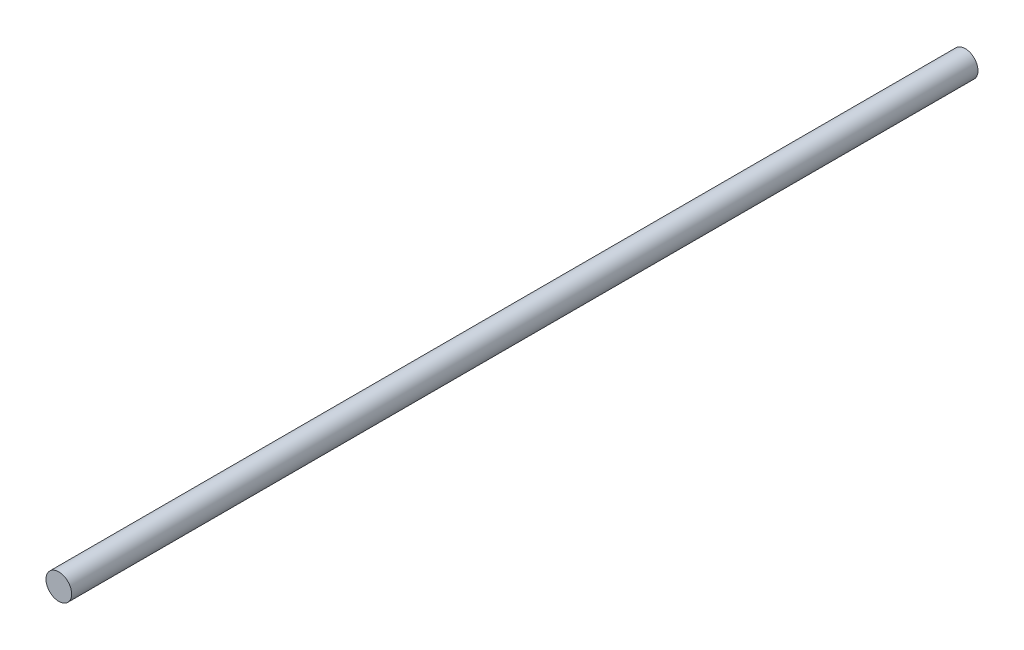
ISO-10303-21;
HEADER;
FILE_DESCRIPTION(('STEP AP214'),'2;1');
FILE_NAME('part.step','',(''),(''),'','','');
FILE_SCHEMA(('AUTOMOTIVE_DESIGN { 1 0 10303 214 1 1 1 1 }'));
ENDSEC;
DATA;
#1=APPLICATION_CONTEXT('core data for automotive mechanical design processes');
#2=APPLICATION_PROTOCOL_DEFINITION('international standard','automotive_design',2000,#1);
#3=PRODUCT_CONTEXT('',#1,'mechanical');
#4=PRODUCT('Part','Part','',(#3));
#5=PRODUCT_RELATED_PRODUCT_CATEGORY('part','',(#4));
#6=PRODUCT_DEFINITION_FORMATION('','',#4);
#7=PRODUCT_DEFINITION_CONTEXT('part definition',#1,'design');
#8=PRODUCT_DEFINITION('design','',#6,#7);
#9=PRODUCT_DEFINITION_SHAPE('','',#8);
#10=(LENGTH_UNIT() NAMED_UNIT(*) SI_UNIT(.MILLI.,.METRE.));
#11=(NAMED_UNIT(*) PLANE_ANGLE_UNIT() SI_UNIT($,.RADIAN.));
#12=(NAMED_UNIT(*) SI_UNIT($,.STERADIAN.) SOLID_ANGLE_UNIT());
#13=UNCERTAINTY_MEASURE_WITH_UNIT(LENGTH_MEASURE(1.E-05),#10,'distance_accuracy_value','');
#14=(GEOMETRIC_REPRESENTATION_CONTEXT(3) GLOBAL_UNCERTAINTY_ASSIGNED_CONTEXT((#13)) GLOBAL_UNIT_ASSIGNED_CONTEXT((#10,
#11,#12)) REPRESENTATION_CONTEXT('',''));
#15=CARTESIAN_POINT('',(0.,0.,0.));
#16=DIRECTION('',(0.,0.,1.));
#17=DIRECTION('',(1.,0.,0.));
#18=AXIS2_PLACEMENT_3D('',#15,#16,#17);
#19=CARTESIAN_POINT('',(0.,0.,169.));
#20=DIRECTION('',(0.,0.,-1.));
#21=DIRECTION('',(-1.,0.,0.));
#22=AXIS2_PLACEMENT_3D('',#19,#20,#21);
#23=CYLINDRICAL_SURFACE('',#22,2.39);
#24=CARTESIAN_POINT('',(0.,0.,169.));
#25=DIRECTION('',(0.,0.,1.));
#26=DIRECTION('',(1.,0.,0.));
#27=AXIS2_PLACEMENT_3D('',#24,#25,#26);
#28=CIRCLE('',#27,2.39);
#29=CARTESIAN_POINT('',(2.39,0.,169.));
#30=VERTEX_POINT('',#29);
#31=EDGE_CURVE('E10',#30,#30,#28,.T.);
#32=ORIENTED_EDGE('',*,*,#31,.F.);
#33=EDGE_LOOP('',(#32));
#34=FACE_BOUND('',#33,.T.);
#35=CARTESIAN_POINT('',(0.,0.,0.));
#36=DIRECTION('',(0.,0.,1.));
#37=DIRECTION('',(1.,0.,0.));
#38=AXIS2_PLACEMENT_3D('',#35,#36,#37);
#39=CIRCLE('',#38,2.39);
#40=CARTESIAN_POINT('',(2.39,0.,0.));
#41=VERTEX_POINT('',#40);
#42=EDGE_CURVE('E44',#41,#41,#39,.T.);
#43=ORIENTED_EDGE('',*,*,#42,.T.);
#44=EDGE_LOOP('',(#43));
#45=FACE_BOUND('',#44,.T.);
#46=ADVANCED_FACE('F41',(#34,#45),#23,.T.);
#47=CARTESIAN_POINT('',(0.,0.,169.));
#48=DIRECTION('',(0.,0.,1.));
#49=DIRECTION('',(1.,0.,0.));
#50=AXIS2_PLACEMENT_3D('',#47,#48,#49);
#51=PLANE('',#50);
#52=ORIENTED_EDGE('',*,*,#31,.T.);
#53=EDGE_LOOP('',(#52));
#54=FACE_BOUND('',#53,.T.);
#55=ADVANCED_FACE('F56',(#54),#51,.T.);
#56=CARTESIAN_POINT('',(0.,0.,0.));
#57=DIRECTION('',(0.,0.,1.));
#58=DIRECTION('',(1.,0.,0.));
#59=AXIS2_PLACEMENT_3D('',#56,#57,#58);
#60=PLANE('',#59);
#61=ORIENTED_EDGE('',*,*,#42,.F.);
#62=EDGE_LOOP('',(#61));
#63=FACE_BOUND('',#62,.T.);
#64=ADVANCED_FACE('F54',(#63),#60,.F.);
#65=CLOSED_SHELL('',(#46,#55,#64));
#66=MANIFOLD_SOLID_BREP('B2',#65);
#67=ADVANCED_BREP_SHAPE_REPRESENTATION('',(#18,#66),#14);
#68=SHAPE_DEFINITION_REPRESENTATION(#9,#67);
ENDSEC;
END-ISO-10303-21;
